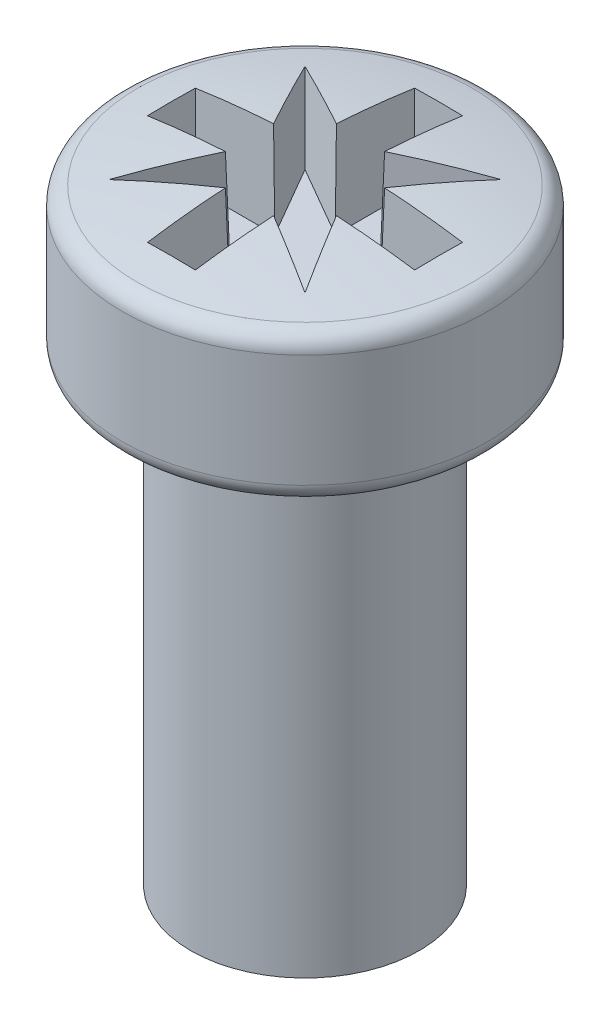
ISO-10303-21;
HEADER;
FILE_DESCRIPTION(('STEP AP214'),'2;1');
FILE_NAME('part.step','',(''),(''),'','','');
FILE_SCHEMA(('AUTOMOTIVE_DESIGN { 1 0 10303 214 1 1 1 1 }'));
ENDSEC;
DATA;
#1=APPLICATION_CONTEXT('core data for automotive mechanical design processes');
#2=APPLICATION_PROTOCOL_DEFINITION('international standard','automotive_design',2000,#1);
#3=PRODUCT_CONTEXT('',#1,'mechanical');
#4=PRODUCT('Part','Part','',(#3));
#5=PRODUCT_RELATED_PRODUCT_CATEGORY('part','',(#4));
#6=PRODUCT_DEFINITION_FORMATION('','',#4);
#7=PRODUCT_DEFINITION_CONTEXT('part definition',#1,'design');
#8=PRODUCT_DEFINITION('design','',#6,#7);
#9=PRODUCT_DEFINITION_SHAPE('','',#8);
#10=(LENGTH_UNIT() NAMED_UNIT(*) SI_UNIT(.MILLI.,.METRE.));
#11=(NAMED_UNIT(*) PLANE_ANGLE_UNIT() SI_UNIT($,.RADIAN.));
#12=(NAMED_UNIT(*) SI_UNIT($,.STERADIAN.) SOLID_ANGLE_UNIT());
#13=UNCERTAINTY_MEASURE_WITH_UNIT(LENGTH_MEASURE(1.E-05),#10,'distance_accuracy_value','');
#14=(GEOMETRIC_REPRESENTATION_CONTEXT(3) GLOBAL_UNCERTAINTY_ASSIGNED_CONTEXT((#13)) GLOBAL_UNIT_ASSIGNED_CONTEXT((#10,
#11,#12)) REPRESENTATION_CONTEXT('',''));
#15=CARTESIAN_POINT('',(0.,0.,0.));
#16=DIRECTION('',(0.,0.,1.));
#17=DIRECTION('',(1.,0.,0.));
#18=AXIS2_PLACEMENT_3D('',#15,#16,#17);
#19=CARTESIAN_POINT('',(1.45,0.75,0.25));
#20=DIRECTION('',(0.,1.,0.));
#21=DIRECTION('',(0.,0.,1.));
#22=AXIS2_PLACEMENT_3D('',#19,#20,#21);
#23=PLANE('',#22);
#24=DIRECTION('',(0.866025403784437,0.,0.500000000000003));
#25=VECTOR('',#24,1.);
#26=CARTESIAN_POINT('',(1.04261448545027,0.75,1.0366534699211));
#27=LINE('',#26,#25);
#28=CARTESIAN_POINT('',(0.245636233767946,0.75,0.576517861774035));
#29=VERTEX_POINT('',#28);
#30=CARTESIAN_POINT('',(1.02851057127591,0.75,1.02851057127591));
#31=VERTEX_POINT('',#30);
#32=EDGE_CURVE('E401',#29,#31,#27,.T.);
#33=ORIENTED_EDGE('',*,*,#32,.T.);
#34=DIRECTION('',(-0.500000000000003,0.,-0.866025403784437));
#35=VECTOR('',#34,1.);
#36=CARTESIAN_POINT('',(0.580296994187172,0.75,0.252181883116027));
#37=LINE('',#36,#35);
#38=CARTESIAN_POINT('',(0.576517861774036,0.75,0.245636233767945));
#39=VERTEX_POINT('',#38);
#40=EDGE_CURVE('E406',#31,#39,#37,.T.);
#41=ORIENTED_EDGE('',*,*,#40,.T.);
#42=DIRECTION('',(1.,0.,0.));
#43=VECTOR('',#42,1.);
#44=CARTESIAN_POINT('',(0.584076126600307,0.75,0.245636233767946));
#45=LINE('',#44,#43);
#46=CARTESIAN_POINT('',(1.44563623376795,0.75,0.245636233767946));
#47=VERTEX_POINT('',#46);
#48=EDGE_CURVE('E419',#39,#47,#45,.T.);
#49=ORIENTED_EDGE('',*,*,#48,.T.);
#50=DIRECTION('',(0.,0.,1.));
#51=VECTOR('',#50,1.);
#52=CARTESIAN_POINT('',(1.44563623376795,0.75,0.25));
#53=LINE('',#52,#51);
#54=CARTESIAN_POINT('',(1.44563623376795,0.75,-0.245636233767946));
#55=VERTEX_POINT('',#54);
#56=EDGE_CURVE('E415',#47,#55,#53,.F.);
#57=ORIENTED_EDGE('',*,*,#56,.T.);
#58=DIRECTION('',(1.,0.,0.));
#59=VECTOR('',#58,1.);
#60=CARTESIAN_POINT('',(0.584076126600307,0.75,-0.245636233767946));
#61=LINE('',#60,#59);
#62=CARTESIAN_POINT('',(0.576517861774036,0.75,-0.245636233767946));
#63=VERTEX_POINT('',#62);
#64=EDGE_CURVE('E409',#55,#63,#61,.F.);
#65=ORIENTED_EDGE('',*,*,#64,.T.);
#66=DIRECTION('',(0.500000000000002,0.,-0.866025403784438));
#67=VECTOR('',#66,1.);
#68=CARTESIAN_POINT('',(0.580296994187172,0.75,-0.252181883116027));
#69=LINE('',#68,#67);
#70=CARTESIAN_POINT('',(1.02851057127591,0.75,-1.02851057127591));
#71=VERTEX_POINT('',#70);
#72=EDGE_CURVE('E423',#63,#71,#69,.T.);
#73=ORIENTED_EDGE('',*,*,#72,.T.);
#74=DIRECTION('',(-0.866025403784437,0.,0.500000000000004));
#75=VECTOR('',#74,1.);
#76=CARTESIAN_POINT('',(1.04261448545027,0.75,-1.03665346992111));
#77=LINE('',#76,#75);
#78=CARTESIAN_POINT('',(0.245636233767946,0.75,-0.576517861774035));
#79=VERTEX_POINT('',#78);
#80=EDGE_CURVE('E428',#71,#79,#77,.T.);
#81=ORIENTED_EDGE('',*,*,#80,.T.);
#82=DIRECTION('',(0.,0.,1.));
#83=VECTOR('',#82,1.);
#84=CARTESIAN_POINT('',(0.245636233767946,0.75,-1.45));
#85=LINE('',#84,#83);
#86=CARTESIAN_POINT('',(0.245636233767946,0.75,-1.44563623376794));
#87=VERTEX_POINT('',#86);
#88=EDGE_CURVE('E272',#79,#87,#85,.F.);
#89=ORIENTED_EDGE('',*,*,#88,.T.);
#90=DIRECTION('',(1.,0.,0.));
#91=VECTOR('',#90,1.);
#92=CARTESIAN_POINT('',(-0.250000000000001,0.75,-1.44563623376795));
#93=LINE('',#92,#91);
#94=CARTESIAN_POINT('',(-0.245636233767947,0.75,-1.44563623376795));
#95=VERTEX_POINT('',#94);
#96=EDGE_CURVE('E273',#87,#95,#93,.F.);
#97=ORIENTED_EDGE('',*,*,#96,.T.);
#98=DIRECTION('',(0.,0.,1.));
#99=VECTOR('',#98,1.);
#100=CARTESIAN_POINT('',(-0.245636233767947,0.75,-1.45));
#101=LINE('',#100,#99);
#102=CARTESIAN_POINT('',(-0.245636233767946,0.75,-0.576517861774035));
#103=VERTEX_POINT('',#102);
#104=EDGE_CURVE('E278',#95,#103,#101,.T.);
#105=ORIENTED_EDGE('',*,*,#104,.T.);
#106=DIRECTION('',(-0.866025403784437,0.,-0.500000000000004));
#107=VECTOR('',#106,1.);
#108=CARTESIAN_POINT('',(-1.04261448545027,0.75,-1.03665346992111));
#109=LINE('',#108,#107);
#110=CARTESIAN_POINT('',(-1.02851057127591,0.75,-1.02851057127591));
#111=VERTEX_POINT('',#110);
#112=EDGE_CURVE('E283',#103,#111,#109,.T.);
#113=ORIENTED_EDGE('',*,*,#112,.T.);
#114=DIRECTION('',(0.500000000000002,0.,0.866025403784438));
#115=VECTOR('',#114,1.);
#116=CARTESIAN_POINT('',(-0.580296994187172,0.75,-0.252181883116027));
#117=LINE('',#116,#115);
#118=CARTESIAN_POINT('',(-0.576517861774036,0.75,-0.245636233767945));
#119=VERTEX_POINT('',#118);
#120=EDGE_CURVE('E288',#111,#119,#117,.T.);
#121=ORIENTED_EDGE('',*,*,#120,.T.);
#122=DIRECTION('',(1.,0.,0.));
#123=VECTOR('',#122,1.);
#124=CARTESIAN_POINT('',(-0.584076126600307,0.75,-0.245636233767946));
#125=LINE('',#124,#123);
#126=CARTESIAN_POINT('',(-1.44563623376795,0.75,-0.245636233767946));
#127=VERTEX_POINT('',#126);
#128=EDGE_CURVE('E293',#119,#127,#125,.F.);
#129=ORIENTED_EDGE('',*,*,#128,.T.);
#130=DIRECTION('',(0.,0.,1.));
#131=VECTOR('',#130,1.);
#132=CARTESIAN_POINT('',(-1.44563623376795,0.75,0.250000000000001));
#133=LINE('',#132,#131);
#134=CARTESIAN_POINT('',(-1.44563623376795,0.75,0.245636233767947));
#135=VERTEX_POINT('',#134);
#136=EDGE_CURVE('E452',#127,#135,#133,.T.);
#137=ORIENTED_EDGE('',*,*,#136,.T.);
#138=DIRECTION('',(1.,0.,0.));
#139=VECTOR('',#138,1.);
#140=CARTESIAN_POINT('',(-0.584076126600307,0.75,0.245636233767946));
#141=LINE('',#140,#139);
#142=CARTESIAN_POINT('',(-0.576517861774036,0.75,0.245636233767946));
#143=VERTEX_POINT('',#142);
#144=EDGE_CURVE('E457',#135,#143,#141,.T.);
#145=ORIENTED_EDGE('',*,*,#144,.T.);
#146=DIRECTION('',(-0.500000000000003,0.,0.866025403784437));
#147=VECTOR('',#146,1.);
#148=CARTESIAN_POINT('',(-0.580296994187172,0.75,0.252181883116027));
#149=LINE('',#148,#147);
#150=CARTESIAN_POINT('',(-1.02851057127591,0.75,1.02851057127591));
#151=VERTEX_POINT('',#150);
#152=EDGE_CURVE('E462',#143,#151,#149,.T.);
#153=ORIENTED_EDGE('',*,*,#152,.T.);
#154=DIRECTION('',(0.866025403784437,0.,-0.500000000000003));
#155=VECTOR('',#154,1.);
#156=CARTESIAN_POINT('',(-1.04261448545027,0.75,1.0366534699211));
#157=LINE('',#156,#155);
#158=CARTESIAN_POINT('',(-0.245636233767946,0.75,0.576517861774035));
#159=VERTEX_POINT('',#158);
#160=EDGE_CURVE('E467',#151,#159,#157,.T.);
#161=ORIENTED_EDGE('',*,*,#160,.T.);
#162=DIRECTION('',(0.,0.,1.));
#163=VECTOR('',#162,1.);
#164=CARTESIAN_POINT('',(-0.245636233767945,0.75,1.45));
#165=LINE('',#164,#163);
#166=CARTESIAN_POINT('',(-0.245636233767945,0.75,1.44563623376795));
#167=VERTEX_POINT('',#166);
#168=EDGE_CURVE('E390',#159,#167,#165,.T.);
#169=ORIENTED_EDGE('',*,*,#168,.T.);
#170=DIRECTION('',(1.,0.,0.));
#171=VECTOR('',#170,1.);
#172=CARTESIAN_POINT('',(-0.25,0.75,1.44563623376795));
#173=LINE('',#172,#171);
#174=CARTESIAN_POINT('',(0.245636233767947,0.75,1.44563623376795));
#175=VERTEX_POINT('',#174);
#176=EDGE_CURVE('E391',#167,#175,#173,.T.);
#177=ORIENTED_EDGE('',*,*,#176,.T.);
#178=DIRECTION('',(0.,0.,1.));
#179=VECTOR('',#178,1.);
#180=CARTESIAN_POINT('',(0.245636233767947,0.75,1.45));
#181=LINE('',#180,#179);
#182=EDGE_CURVE('E396',#175,#29,#181,.F.);
#183=ORIENTED_EDGE('',*,*,#182,.T.);
#184=EDGE_LOOP('',(#33,#41,#49,#57,#65,#73,#81,#89,#97,#105,#113,#121,#129,#137,#145,#153,#161,
#169,#177,#183));
#185=FACE_BOUND('',#184,.T.);
#186=ADVANCED_FACE('F16',(#185),#23,.T.);
#187=CARTESIAN_POINT('',(0.584076126600307,1.,0.25));
#188=DIRECTION('',(0.,-0.0174524064372835,0.999847695156391));
#189=DIRECTION('',(0.,-0.999847695156391,-0.0174524064372835));
#190=AXIS2_PLACEMENT_3D('',#187,#188,#189);
#191=PLANE('',#190);
#192=ORIENTED_EDGE('',*,*,#48,.F.);
#193=DIRECTION('',(0.0302146533529296,0.999391197828466,0.0174444382467851));
#194=VECTOR('',#193,1.);
#195=CARTESIAN_POINT('',(0.576517861774036,0.75,0.245636233767945));
#196=LINE('',#195,#194);
#197=CARTESIAN_POINT('',(0.607598757212809,1.77804334093299,0.263580797282622));
#198=VERTEX_POINT('',#197);
#199=EDGE_CURVE('E404',#39,#198,#196,.T.);
#200=ORIENTED_EDGE('',*,*,#199,.T.);
#201=CARTESIAN_POINT('',(1.46202785908939,1.68907558573134,0.262027859089389));
#202=CARTESIAN_POINT('',(1.32026032340579,1.71002232539284,0.262393485790215));
#203=CARTESIAN_POINT('',(1.17817413049149,1.72790967481918,0.262705710635846));
#204=CARTESIAN_POINT('',(0.893364430201512,1.7575655932015,0.263223356616717));
#205=CARTESIAN_POINT('',(0.750640922825825,1.7693341621575,0.263428777751957));
#206=CARTESIAN_POINT('',(0.607598758219443,1.77804334087832,0.263580797032002));
#207=B_SPLINE_CURVE_WITH_KNOTS('',3,(#201,#202,#203,#204,#205,#206),.UNSPECIFIED.,.F.,.F.,(4,2,
4),(0.,0.429624101670975,0.85924820334195),.UNSPECIFIED.);
#208=CARTESIAN_POINT('',(1.46202785908939,1.68907558573134,0.26202785908939));
#209=VERTEX_POINT('',#208);
#210=EDGE_CURVE('E177',#209,#198,#207,.T.);
#211=ORIENTED_EDGE('',*,*,#210,.F.);
#212=DIRECTION('',(-0.0174497491606828,-0.999695459881887,-0.0174497491606828));
#213=VECTOR('',#212,1.);
#214=CARTESIAN_POINT('',(1.46202785908939,1.68907558573133,0.26202785908939));
#215=LINE('',#214,#213);
#216=EDGE_CURVE('E173',#209,#47,#215,.T.);
#217=ORIENTED_EDGE('',*,*,#216,.T.);
#218=EDGE_LOOP('',(#192,#200,#211,#217));
#219=FACE_BOUND('',#218,.T.);
#220=ADVANCED_FACE('F677',(#219),#191,.F.);
#221=CARTESIAN_POINT('',(0.584076126600307,1.,0.25));
#222=DIRECTION('',(0.865893503920752,-0.0174524064372836,-0.499923847578198));
#223=DIRECTION('',(-0.500000000000003,0.,-0.866025403784437));
#224=AXIS2_PLACEMENT_3D('',#221,#222,#223);
#225=PLANE('',#224);
#226=ORIENTED_EDGE('',*,*,#40,.F.);
#227=DIRECTION('',(0.0475800424954295,0.997733571206395,0.0475800424954295));
#228=VECTOR('',#227,1.);
#229=CARTESIAN_POINT('',(1.02851057127591,0.75,1.02851057127591));
#230=LINE('',#229,#228);
#231=CARTESIAN_POINT('',(1.07306003218654,1.68418354416022,1.07306003218654));
#232=VERTEX_POINT('',#231);
#233=EDGE_CURVE('E399',#31,#232,#230,.T.);
#234=ORIENTED_EDGE('',*,*,#233,.T.);
#235=CARTESIAN_POINT('',(0.607598757356492,1.77804334091766,0.263580797532024));
#236=CARTESIAN_POINT('',(0.685653461591582,1.76970725355828,0.399066524929171));
#237=CARTESIAN_POINT('',(0.763469253278298,1.75771756014881,0.53426599151562));
#238=CARTESIAN_POINT('',(0.918623011554979,1.72643096122967,0.804092403067125));
#239=CARTESIAN_POINT('',(0.995960978144946,1.70713405571999,0.93871934803218));
#240=CARTESIAN_POINT('',(1.07306003218654,1.68418354416022,1.07306003218654));
#241=B_SPLINE_CURVE_WITH_KNOTS('',3,(#235,#236,#237,#238,#239,#240),.UNSPECIFIED.,.F.,.F.,(4,2,
4),(0.,0.469362880447843,0.938725760895685),.UNSPECIFIED.);
#242=EDGE_CURVE('E773',#198,#232,#241,.T.);
#243=ORIENTED_EDGE('',*,*,#242,.F.);
#244=ORIENTED_EDGE('',*,*,#199,.F.);
#245=EDGE_LOOP('',(#226,#234,#243,#244));
#246=FACE_BOUND('',#245,.T.);
#247=ADVANCED_FACE('F670',(#246),#225,.F.);
#248=CARTESIAN_POINT('',(1.04043260233424,1.,1.04043260233424));
#249=DIRECTION('',(-0.499923847578198,-0.0174524064372836,0.865893503920752));
#250=DIRECTION('',(0.866025403784437,0.,0.500000000000003));
#251=AXIS2_PLACEMENT_3D('',#248,#249,#250);
#252=PLANE('',#251);
#253=ORIENTED_EDGE('',*,*,#32,.F.);
#254=DIRECTION('',(0.017444438246785,0.999391197828466,0.0302146533529296));
#255=VECTOR('',#254,1.);
#256=CARTESIAN_POINT('',(0.245636233767946,0.75,0.576517861774035));
#257=LINE('',#256,#255);
#258=CARTESIAN_POINT('',(0.26358079703322,1.77804334094833,0.607598757069126));
#259=VERTEX_POINT('',#258);
#260=EDGE_CURVE('E394',#29,#259,#257,.T.);
#261=ORIENTED_EDGE('',*,*,#260,.T.);
#262=CARTESIAN_POINT('',(1.07306003218653,1.68418354416022,1.07306003218654));
#263=CARTESIAN_POINT('',(0.938719347949565,1.7071340557341,0.995960978097533));
#264=CARTESIAN_POINT('',(0.804092402901637,1.72643096125338,0.918623011459912));
#265=CARTESIAN_POINT('',(0.534265991183865,1.75771756018275,0.763469253087442));
#266=CARTESIAN_POINT('',(0.399066524514021,1.76970725359284,0.685653461352592));
#267=CARTESIAN_POINT('',(0.263580797033219,1.77804334094834,0.607598757069127));
#268=B_SPLINE_CURVE_WITH_KNOTS('',3,(#262,#263,#264,#265,#266,#267),.UNSPECIFIED.,.F.,.F.,(4,2,
4),(0.,0.469362880736001,0.938725761472001),.UNSPECIFIED.);
#269=EDGE_CURVE('E769',#232,#259,#268,.T.);
#270=ORIENTED_EDGE('',*,*,#269,.F.);
#271=ORIENTED_EDGE('',*,*,#233,.F.);
#272=EDGE_LOOP('',(#253,#261,#270,#271));
#273=FACE_BOUND('',#272,.T.);
#274=ADVANCED_FACE('F663',(#273),#252,.F.);
#275=CARTESIAN_POINT('',(0.250000000000001,1.,1.45));
#276=DIRECTION('',(0.999847695156391,-0.0174524064372835,0.));
#277=DIRECTION('',(0.0174524064372835,0.999847695156391,0.));
#278=AXIS2_PLACEMENT_3D('',#275,#276,#277);
#279=PLANE('',#278);
#280=ORIENTED_EDGE('',*,*,#182,.F.);
#281=DIRECTION('',(0.0174497491606828,0.999695459881887,0.0174497491606828));
#282=VECTOR('',#281,1.);
#283=CARTESIAN_POINT('',(0.245636233767947,0.75,1.44563623376795));
#284=LINE('',#283,#282);
#285=CARTESIAN_POINT('',(0.262027859089391,1.68907558573133,1.46202785908939));
#286=VERTEX_POINT('',#285);
#287=EDGE_CURVE('E383',#175,#286,#284,.T.);
#288=ORIENTED_EDGE('',*,*,#287,.T.);
#289=CARTESIAN_POINT('',(0.263580797033219,1.77804334094834,0.607598757069126));
#290=CARTESIAN_POINT('',(0.26342877775326,1.76933416223229,0.750640921868584));
#291=CARTESIAN_POINT('',(0.263223356617962,1.75756559327285,0.893364429436668));
#292=CARTESIAN_POINT('',(0.262705710636685,1.72790967486718,1.17817413011009));
#293=CARTESIAN_POINT('',(0.262393485790708,1.71002232542096,1.32026032321543));
#294=CARTESIAN_POINT('',(0.262027859089391,1.68907558573134,1.46202785908939));
#295=B_SPLINE_CURVE_WITH_KNOTS('',3,(#289,#290,#291,#292,#293,#294),.UNSPECIFIED.,.F.,.F.,(4,2,
4),(0.,0.429624102247064,0.859248204494128),.UNSPECIFIED.);
#296=EDGE_CURVE('E380',#259,#286,#295,.T.);
#297=ORIENTED_EDGE('',*,*,#296,.F.);
#298=ORIENTED_EDGE('',*,*,#260,.F.);
#299=EDGE_LOOP('',(#280,#288,#297,#298));
#300=FACE_BOUND('',#299,.T.);
#301=ADVANCED_FACE('F370',(#300),#279,.F.);
#302=CARTESIAN_POINT('',(-0.25,1.,1.45));
#303=DIRECTION('',(0.,-0.0174524064372835,0.999847695156391));
#304=DIRECTION('',(0.,-0.999847695156391,-0.0174524064372835));
#305=AXIS2_PLACEMENT_3D('',#302,#303,#304);
#306=PLANE('',#305);
#307=ORIENTED_EDGE('',*,*,#176,.F.);
#308=DIRECTION('',(-0.0174497491606827,0.999695459881887,0.0174497491606828));
#309=VECTOR('',#308,1.);
#310=CARTESIAN_POINT('',(-0.245636233767945,0.75,1.44563623376795));
#311=LINE('',#310,#309);
#312=CARTESIAN_POINT('',(-0.26202785908939,1.68907558573134,1.46202785908939));
#313=VERTEX_POINT('',#312);
#314=EDGE_CURVE('E469',#167,#313,#311,.T.);
#315=ORIENTED_EDGE('',*,*,#314,.T.);
#316=CARTESIAN_POINT('',(0.262027859089391,1.68907558573133,1.46202785908939));
#317=CARTESIAN_POINT('',(0.,1.69600058834905,1.46214873545971));
#318=CARTESIAN_POINT('',(-0.26202785908939,1.68907558573133,1.46202785908939));
#319=B_SPLINE_CURVE_WITH_KNOTS('',2,(#316,#317,#318),.UNSPECIFIED.,.F.,.F.,(3,3),(0.,1.),.UNSPECIFIED.);
#320=EDGE_CURVE('E375',#286,#313,#319,.T.);
#321=ORIENTED_EDGE('',*,*,#320,.F.);
#322=ORIENTED_EDGE('',*,*,#287,.F.);
#323=EDGE_LOOP('',(#307,#315,#321,#322));
#324=FACE_BOUND('',#323,.T.);
#325=ADVANCED_FACE('F365',(#324),#306,.F.);
#326=CARTESIAN_POINT('',(-0.25,1.,1.45));
#327=DIRECTION('',(-0.999847695156391,-0.0174524064372835,0.));
#328=DIRECTION('',(0.0174524064372835,-0.999847695156391,0.));
#329=AXIS2_PLACEMENT_3D('',#326,#327,#328);
#330=PLANE('',#329);
#331=ORIENTED_EDGE('',*,*,#168,.F.);
#332=DIRECTION('',(-0.017444438246785,0.999391197828466,0.0302146533529295));
#333=VECTOR('',#332,1.);
#334=CARTESIAN_POINT('',(-0.245636233767946,0.75,0.576517861774035));
#335=LINE('',#334,#333);
#336=CARTESIAN_POINT('',(-0.263580797033221,1.77804334094833,0.607598757069126));
#337=VERTEX_POINT('',#336);
#338=EDGE_CURVE('E464',#159,#337,#335,.T.);
#339=ORIENTED_EDGE('',*,*,#338,.T.);
#340=CARTESIAN_POINT('',(-0.26202785908939,1.68907558573134,1.46202785908939));
#341=CARTESIAN_POINT('',(-0.262393485790707,1.71002232542096,1.32026032321543));
#342=CARTESIAN_POINT('',(-0.262705710636684,1.72790967486718,1.17817413011009));
#343=CARTESIAN_POINT('',(-0.263223356617961,1.75756559327285,0.893364429436668));
#344=CARTESIAN_POINT('',(-0.263428777753261,1.76933416223229,0.750640921868584));
#345=CARTESIAN_POINT('',(-0.263580797033221,1.77804334094834,0.607598757069126));
#346=B_SPLINE_CURVE_WITH_KNOTS('',3,(#340,#341,#342,#343,#344,#345),.UNSPECIFIED.,.F.,.F.,(4,2,
4),(0.,0.429624102247064,0.859248204494128),.UNSPECIFIED.);
#347=EDGE_CURVE('E351',#313,#337,#346,.T.);
#348=ORIENTED_EDGE('',*,*,#347,.F.);
#349=ORIENTED_EDGE('',*,*,#314,.F.);
#350=EDGE_LOOP('',(#331,#339,#348,#349));
#351=FACE_BOUND('',#350,.T.);
#352=ADVANCED_FACE('F360',(#351),#330,.F.);
#353=CARTESIAN_POINT('',(-1.04043260233424,1.,1.04043260233424));
#354=DIRECTION('',(0.499923847578198,-0.0174524064372836,0.865893503920752));
#355=DIRECTION('',(0.866025403784437,0.,-0.500000000000003));
#356=AXIS2_PLACEMENT_3D('',#353,#354,#355);
#357=PLANE('',#356);
#358=ORIENTED_EDGE('',*,*,#160,.F.);
#359=DIRECTION('',(-0.0475800424954293,0.997733571206395,0.0475800424954295));
#360=VECTOR('',#359,1.);
#361=CARTESIAN_POINT('',(-1.02851057127591,0.75,1.02851057127591));
#362=LINE('',#361,#360);
#363=CARTESIAN_POINT('',(-1.07306003218654,1.68418354416022,1.07306003218654));
#364=VERTEX_POINT('',#363);
#365=EDGE_CURVE('E459',#151,#364,#362,.T.);
#366=ORIENTED_EDGE('',*,*,#365,.T.);
#367=CARTESIAN_POINT('',(-0.263580797033221,1.77804334094834,0.607598757069126));
#368=CARTESIAN_POINT('',(-0.399066524514022,1.76970725359284,0.685653461352592));
#369=CARTESIAN_POINT('',(-0.534265991183866,1.75771756018275,0.763469253087442));
#370=CARTESIAN_POINT('',(-0.804092402901637,1.72643096125338,0.918623011459913));
#371=CARTESIAN_POINT('',(-0.938719347949565,1.7071340557341,0.995960978097534));
#372=CARTESIAN_POINT('',(-1.07306003218654,1.68418354416022,1.07306003218654));
#373=B_SPLINE_CURVE_WITH_KNOTS('',3,(#367,#368,#369,#370,#371,#372),.UNSPECIFIED.,.F.,.F.,(4,2,
4),(0.,0.469362880736001,0.938725761472001),.UNSPECIFIED.);
#374=EDGE_CURVE('E345',#337,#364,#373,.T.);
#375=ORIENTED_EDGE('',*,*,#374,.F.);
#376=ORIENTED_EDGE('',*,*,#338,.F.);
#377=EDGE_LOOP('',(#358,#366,#375,#376));
#378=FACE_BOUND('',#377,.T.);
#379=ADVANCED_FACE('F357',(#378),#357,.F.);
#380=CARTESIAN_POINT('',(-0.584076126600307,1.,0.25));
#381=DIRECTION('',(-0.865893503920752,-0.0174524064372836,-0.499923847578198));
#382=DIRECTION('',(-0.500000000000003,0.,0.866025403784437));
#383=AXIS2_PLACEMENT_3D('',#380,#381,#382);
#384=PLANE('',#383);
#385=ORIENTED_EDGE('',*,*,#152,.F.);
#386=DIRECTION('',(-0.0302146533529296,0.999391197828466,0.0174444382467851));
#387=VECTOR('',#386,1.);
#388=CARTESIAN_POINT('',(-0.576517861774036,0.75,0.245636233767946));
#389=LINE('',#388,#387);
#390=CARTESIAN_POINT('',(-0.607598757354815,1.77804334093095,0.263580797032916));
#391=VERTEX_POINT('',#390);
#392=EDGE_CURVE('E454',#143,#391,#389,.T.);
#393=ORIENTED_EDGE('',*,*,#392,.T.);
#394=CARTESIAN_POINT('',(-1.07306003218654,1.68418354416022,1.07306003218654));
#395=CARTESIAN_POINT('',(-0.995960978192184,1.70713405570594,0.938719348114491));
#396=CARTESIAN_POINT('',(-0.918623011649697,1.72643096120604,0.804092403232006));
#397=CARTESIAN_POINT('',(-0.763469253468453,1.757717560115,0.53426599184616));
#398=CARTESIAN_POINT('',(-0.685653461829697,1.76970725352386,0.399066525342798));
#399=CARTESIAN_POINT('',(-0.607598757642805,1.7780433408871,0.263580798028999));
#400=B_SPLINE_CURVE_WITH_KNOTS('',3,(#394,#395,#396,#397,#398,#399),.UNSPECIFIED.,.F.,.F.,(4,2,
4),(0.,0.46936288016074,0.93872576032148),.UNSPECIFIED.);
#401=EDGE_CURVE('E334',#364,#391,#400,.T.);
#402=ORIENTED_EDGE('',*,*,#401,.F.);
#403=ORIENTED_EDGE('',*,*,#365,.F.);
#404=EDGE_LOOP('',(#385,#393,#402,#403));
#405=FACE_BOUND('',#404,.T.);
#406=ADVANCED_FACE('F323',(#405),#384,.F.);
#407=CARTESIAN_POINT('',(-0.584076126600307,1.,0.25));
#408=DIRECTION('',(0.,-0.0174524064372835,0.999847695156391));
#409=DIRECTION('',(0.,-0.999847695156391,-0.0174524064372835));
#410=AXIS2_PLACEMENT_3D('',#407,#408,#409);
#411=PLANE('',#410);
#412=ORIENTED_EDGE('',*,*,#144,.F.);
#413=DIRECTION('',(-0.0174497491606828,0.999695459881887,0.0174497491606828));
#414=VECTOR('',#413,1.);
#415=CARTESIAN_POINT('',(-1.44563623376795,0.75,0.245636233767947));
#416=LINE('',#415,#414);
#417=CARTESIAN_POINT('',(-1.46202785908939,1.68907558573133,0.262027859089391));
#418=VERTEX_POINT('',#417);
#419=EDGE_CURVE('E449',#135,#418,#416,.T.);
#420=ORIENTED_EDGE('',*,*,#419,.T.);
#421=CARTESIAN_POINT('',(-0.607598757640504,1.77804334091356,0.263580797032611));
#422=CARTESIAN_POINT('',(-0.750640922344059,1.76933416219514,0.263428777752611));
#423=CARTESIAN_POINT('',(-0.893364429816577,1.75756559323741,0.263223356617343));
#424=CARTESIAN_POINT('',(-1.17817413029954,1.72790967484334,0.262705710636269));
#425=CARTESIAN_POINT('',(-1.32026032330998,1.71002232540699,0.262393485790463));
#426=CARTESIAN_POINT('',(-1.46202785908939,1.68907558573134,0.262027859089388));
#427=B_SPLINE_CURVE_WITH_KNOTS('',3,(#421,#422,#423,#424,#425,#426),.UNSPECIFIED.,.F.,.F.,(4,2,
4),(0.,0.429624101960914,0.859248203921828),.UNSPECIFIED.);
#428=EDGE_CURVE('E301',#391,#418,#427,.T.);
#429=ORIENTED_EDGE('',*,*,#428,.F.);
#430=ORIENTED_EDGE('',*,*,#392,.F.);
#431=EDGE_LOOP('',(#412,#420,#429,#430));
#432=FACE_BOUND('',#431,.T.);
#433=ADVANCED_FACE('F315',(#432),#411,.F.);
#434=CARTESIAN_POINT('',(-1.45,1.,0.250000000000001));
#435=DIRECTION('',(-0.999847695156391,-0.0174524064372835,0.));
#436=DIRECTION('',(0.0174524064372835,-0.999847695156391,0.));
#437=AXIS2_PLACEMENT_3D('',#434,#435,#436);
#438=PLANE('',#437);
#439=ORIENTED_EDGE('',*,*,#136,.F.);
#440=DIRECTION('',(-0.0174497491606828,0.999695459881887,-0.0174497491606827));
#441=VECTOR('',#440,1.);
#442=CARTESIAN_POINT('',(-1.44563623376795,0.75,-0.245636233767946));
#443=LINE('',#442,#441);
#444=CARTESIAN_POINT('',(-1.46202785908939,1.68907558573134,-0.262027859089391));
#445=VERTEX_POINT('',#444);
#446=EDGE_CURVE('E291',#127,#445,#443,.T.);
#447=ORIENTED_EDGE('',*,*,#446,.T.);
#448=CARTESIAN_POINT('',(-1.46208828672152,1.69253748245776,0.));
#449=CARTESIAN_POINT('',(-1.46208828672152,1.69253748245776,-0.131036805700679));
#450=CARTESIAN_POINT('',(-1.46202785908939,1.68907558573133,-0.262027859089391));
#451=B_SPLINE_CURVE_WITH_KNOTS('',2,(#448,#449,#450),.UNSPECIFIED.,.F.,.F.,(3,3),(0.,1.),.UNSPECIFIED.);
#452=CARTESIAN_POINT('',(-1.46208828672152,1.69253748245776,0.));
#453=VERTEX_POINT('',#452);
#454=EDGE_CURVE('E300',#453,#445,#451,.T.);
#455=ORIENTED_EDGE('',*,*,#454,.F.);
#456=CARTESIAN_POINT('',(-1.46202785908939,1.68907558573133,0.262027859089391));
#457=CARTESIAN_POINT('',(-1.46208828672152,1.69253748245776,0.131036805700681));
#458=CARTESIAN_POINT('',(-1.46208828672152,1.69253748245776,0.));
#459=B_SPLINE_CURVE_WITH_KNOTS('',2,(#456,#457,#458),.UNSPECIFIED.,.F.,.F.,(3,3),(0.,1.),.UNSPECIFIED.);
#460=EDGE_CURVE('E296',#418,#453,#459,.T.);
#461=ORIENTED_EDGE('',*,*,#460,.F.);
#462=ORIENTED_EDGE('',*,*,#419,.F.);
#463=EDGE_LOOP('',(#439,#447,#455,#461,#462));
#464=FACE_BOUND('',#463,.T.);
#465=ADVANCED_FACE('F304',(#464),#438,.F.);
#466=CARTESIAN_POINT('',(-0.584076126600307,1.,-0.25));
#467=DIRECTION('',(0.,-0.0174524064372835,-0.999847695156391));
#468=DIRECTION('',(0.,0.999847695156391,-0.0174524064372835));
#469=AXIS2_PLACEMENT_3D('',#466,#467,#468);
#470=PLANE('',#469);
#471=ORIENTED_EDGE('',*,*,#128,.F.);
#472=DIRECTION('',(-0.0302146533529296,0.999391197828466,-0.0174444382467851));
#473=VECTOR('',#472,1.);
#474=CARTESIAN_POINT('',(-0.576517861774036,0.75,-0.245636233767945));
#475=LINE('',#474,#473);
#476=CARTESIAN_POINT('',(-0.607598757212808,1.77804334093299,-0.263580797282623));
#477=VERTEX_POINT('',#476);
#478=EDGE_CURVE('E286',#119,#477,#475,.T.);
#479=ORIENTED_EDGE('',*,*,#478,.T.);
#480=CARTESIAN_POINT('',(-1.46202785908939,1.68907558573134,-0.262027859089392));
#481=CARTESIAN_POINT('',(-1.32026032340579,1.71002232539284,-0.262393485790217));
#482=CARTESIAN_POINT('',(-1.1781741304915,1.72790967481918,-0.262705710635847));
#483=CARTESIAN_POINT('',(-0.893364430201513,1.7575655932015,-0.263223356616716));
#484=CARTESIAN_POINT('',(-0.750640922825827,1.7693341621575,-0.263428777751954));
#485=CARTESIAN_POINT('',(-0.607598758219444,1.77804334087832,-0.263580797031997));
#486=B_SPLINE_CURVE_WITH_KNOTS('',3,(#480,#481,#482,#483,#484,#485),.UNSPECIFIED.,.F.,.F.,(4,2,
4),(0.,0.429624101670975,0.85924820334195),.UNSPECIFIED.);
#487=EDGE_CURVE('E335',#445,#477,#486,.T.);
#488=ORIENTED_EDGE('',*,*,#487,.F.);
#489=ORIENTED_EDGE('',*,*,#446,.F.);
#490=EDGE_LOOP('',(#471,#479,#488,#489));
#491=FACE_BOUND('',#490,.T.);
#492=ADVANCED_FACE('F314',(#491),#470,.F.);
#493=CARTESIAN_POINT('',(-0.584076126600307,1.,-0.25));
#494=DIRECTION('',(-0.865893503920753,-0.0174524064372836,0.499923847578197));
#495=DIRECTION('',(0.500000000000002,0.,0.866025403784438));
#496=AXIS2_PLACEMENT_3D('',#493,#494,#495);
#497=PLANE('',#496);
#498=ORIENTED_EDGE('',*,*,#120,.F.);
#499=DIRECTION('',(-0.047580042495429,0.997733571206395,-0.0475800424954293));
#500=VECTOR('',#499,1.);
#501=CARTESIAN_POINT('',(-1.02851057127591,0.75,-1.02851057127591));
#502=LINE('',#501,#500);
#503=CARTESIAN_POINT('',(-1.07306003218653,1.68418354416022,-1.07306003218654));
#504=VERTEX_POINT('',#503);
#505=EDGE_CURVE('E281',#111,#504,#502,.T.);
#506=ORIENTED_EDGE('',*,*,#505,.T.);
#507=CARTESIAN_POINT('',(-0.60759875735649,1.77804334091766,-0.263580797532026));
#508=CARTESIAN_POINT('',(-0.685653461591581,1.76970725355828,-0.399066524929172));
#509=CARTESIAN_POINT('',(-0.763469253278297,1.75771756014881,-0.53426599151562));
#510=CARTESIAN_POINT('',(-0.918623011554978,1.72643096122967,-0.804092403067123));
#511=CARTESIAN_POINT('',(-0.995960978144943,1.70713405571999,-0.938719348032178));
#512=CARTESIAN_POINT('',(-1.07306003218653,1.68418354416022,-1.07306003218654));
#513=B_SPLINE_CURVE_WITH_KNOTS('',3,(#507,#508,#509,#510,#511,#512),.UNSPECIFIED.,.F.,.F.,(4,2,
4),(0.,0.46936288044784,0.93872576089568),.UNSPECIFIED.);
#514=EDGE_CURVE('E818',#477,#504,#513,.T.);
#515=ORIENTED_EDGE('',*,*,#514,.F.);
#516=ORIENTED_EDGE('',*,*,#478,.F.);
#517=EDGE_LOOP('',(#498,#506,#515,#516));
#518=FACE_BOUND('',#517,.T.);
#519=ADVANCED_FACE('F618',(#518),#497,.F.);
#520=CARTESIAN_POINT('',(-1.04043260233424,1.,-1.04043260233424));
#521=DIRECTION('',(0.499923847578199,-0.0174524064372835,-0.865893503920752));
#522=DIRECTION('',(-0.866025403784437,0.,-0.500000000000004));
#523=AXIS2_PLACEMENT_3D('',#520,#521,#522);
#524=PLANE('',#523);
#525=ORIENTED_EDGE('',*,*,#112,.F.);
#526=DIRECTION('',(-0.017444438246785,0.999391197828466,-0.0302146533529296));
#527=VECTOR('',#526,1.);
#528=CARTESIAN_POINT('',(-0.245636233767946,0.75,-0.576517861774035));
#529=LINE('',#528,#527);
#530=CARTESIAN_POINT('',(-0.263580797033221,1.77804334094833,-0.607598757069125));
#531=VERTEX_POINT('',#530);
#532=EDGE_CURVE('E276',#103,#531,#529,.T.);
#533=ORIENTED_EDGE('',*,*,#532,.T.);
#534=CARTESIAN_POINT('',(-1.07306003218653,1.68418354416022,-1.07306003218654));
#535=CARTESIAN_POINT('',(-0.938719347949563,1.7071340557341,-0.995960978097532));
#536=CARTESIAN_POINT('',(-0.804092402901635,1.72643096125338,-0.918623011459912));
#537=CARTESIAN_POINT('',(-0.534265991183864,1.75771756018275,-0.763469253087441));
#538=CARTESIAN_POINT('',(-0.399066524514021,1.76970725359284,-0.68565346135259));
#539=CARTESIAN_POINT('',(-0.263580797033222,1.77804334094834,-0.607598757069122));
#540=B_SPLINE_CURVE_WITH_KNOTS('',3,(#534,#535,#536,#537,#538,#539),.UNSPECIFIED.,.F.,.F.,(4,2,
4),(0.,0.469362880736,0.938725761471999),.UNSPECIFIED.);
#541=EDGE_CURVE('E820',#504,#531,#540,.T.);
#542=ORIENTED_EDGE('',*,*,#541,.F.);
#543=ORIENTED_EDGE('',*,*,#505,.F.);
#544=EDGE_LOOP('',(#525,#533,#542,#543));
#545=FACE_BOUND('',#544,.T.);
#546=ADVANCED_FACE('F611',(#545),#524,.F.);
#547=CARTESIAN_POINT('',(-0.250000000000001,1.,-1.45));
#548=DIRECTION('',(-0.999847695156391,-0.0174524064372835,0.));
#549=DIRECTION('',(0.0174524064372835,-0.999847695156391,0.));
#550=AXIS2_PLACEMENT_3D('',#547,#548,#549);
#551=PLANE('',#550);
#552=ORIENTED_EDGE('',*,*,#104,.F.);
#553=DIRECTION('',(-0.0174497491606829,0.999695459881887,-0.0174497491606828));
#554=VECTOR('',#553,1.);
#555=CARTESIAN_POINT('',(-0.245636233767947,0.75,-1.44563623376795));
#556=LINE('',#555,#554);
#557=CARTESIAN_POINT('',(-0.262027859089391,1.68907558573133,-1.46202785908939));
#558=VERTEX_POINT('',#557);
#559=EDGE_CURVE('E265',#95,#558,#556,.T.);
#560=ORIENTED_EDGE('',*,*,#559,.T.);
#561=CARTESIAN_POINT('',(-0.263580797033221,1.77804334094834,-0.607598757069124));
#562=CARTESIAN_POINT('',(-0.263428777753261,1.76933416223229,-0.750640921868582));
#563=CARTESIAN_POINT('',(-0.263223356617962,1.75756559327285,-0.893364429436667));
#564=CARTESIAN_POINT('',(-0.262705710636686,1.72790967486718,-1.17817413011009));
#565=CARTESIAN_POINT('',(-0.262393485790709,1.71002232542096,-1.32026032321543));
#566=CARTESIAN_POINT('',(-0.262027859089393,1.68907558573134,-1.46202785908939));
#567=B_SPLINE_CURVE_WITH_KNOTS('',3,(#561,#562,#563,#564,#565,#566),.UNSPECIFIED.,.F.,.F.,(4,2,
4),(0.,0.429624102247066,0.859248204494133),.UNSPECIFIED.);
#568=EDGE_CURVE('E262',#531,#558,#567,.T.);
#569=ORIENTED_EDGE('',*,*,#568,.F.);
#570=ORIENTED_EDGE('',*,*,#532,.F.);
#571=EDGE_LOOP('',(#552,#560,#569,#570));
#572=FACE_BOUND('',#571,.T.);
#573=ADVANCED_FACE('F252',(#572),#551,.F.);
#574=CARTESIAN_POINT('',(-0.250000000000001,1.,-1.45));
#575=DIRECTION('',(0.,-0.0174524064372835,-0.999847695156391));
#576=DIRECTION('',(0.,0.999847695156391,-0.0174524064372835));
#577=AXIS2_PLACEMENT_3D('',#574,#575,#576);
#578=PLANE('',#577);
#579=ORIENTED_EDGE('',*,*,#96,.F.);
#580=DIRECTION('',(0.0174497491606827,0.999695459881887,-0.0174497491606828));
#581=VECTOR('',#580,1.);
#582=CARTESIAN_POINT('',(0.245636233767946,0.75,-1.44563623376794));
#583=LINE('',#582,#581);
#584=CARTESIAN_POINT('',(0.262027859089391,1.68907558573134,-1.46202785908939));
#585=VERTEX_POINT('',#584);
#586=EDGE_CURVE('E430',#87,#585,#583,.T.);
#587=ORIENTED_EDGE('',*,*,#586,.T.);
#588=CARTESIAN_POINT('',(-0.262027859089391,1.68907558573133,-1.46202785908939));
#589=CARTESIAN_POINT('',(0.,1.69600058834905,-1.46214873545971));
#590=CARTESIAN_POINT('',(0.26202785908939,1.68907558573133,-1.46202785908939));
#591=B_SPLINE_CURVE_WITH_KNOTS('',2,(#588,#589,#590),.UNSPECIFIED.,.F.,.F.,(3,3),(0.,1.),.UNSPECIFIED.);
#592=EDGE_CURVE('E257',#558,#585,#591,.T.);
#593=ORIENTED_EDGE('',*,*,#592,.F.);
#594=ORIENTED_EDGE('',*,*,#559,.F.);
#595=EDGE_LOOP('',(#579,#587,#593,#594));
#596=FACE_BOUND('',#595,.T.);
#597=ADVANCED_FACE('F247',(#596),#578,.F.);
#598=CARTESIAN_POINT('',(0.25,1.,-1.45));
#599=DIRECTION('',(0.999847695156391,-0.0174524064372835,0.));
#600=DIRECTION('',(0.0174524064372835,0.999847695156391,0.));
#601=AXIS2_PLACEMENT_3D('',#598,#599,#600);
#602=PLANE('',#601);
#603=ORIENTED_EDGE('',*,*,#88,.F.);
#604=DIRECTION('',(0.0174444382467851,0.999391197828466,-0.0302146533529296));
#605=VECTOR('',#604,1.);
#606=CARTESIAN_POINT('',(0.245636233767946,0.75,-0.576517861774035));
#607=LINE('',#606,#605);
#608=CARTESIAN_POINT('',(0.26358079703322,1.77804334094833,-0.607598757069124));
#609=VERTEX_POINT('',#608);
#610=EDGE_CURVE('E425',#79,#609,#607,.T.);
#611=ORIENTED_EDGE('',*,*,#610,.T.);
#612=CARTESIAN_POINT('',(0.262027859089391,1.68907558573134,-1.46202785908939));
#613=CARTESIAN_POINT('',(0.262393485790707,1.71002232542096,-1.32026032321543));
#614=CARTESIAN_POINT('',(0.262705710636685,1.72790967486718,-1.17817413011009));
#615=CARTESIAN_POINT('',(0.263223356617962,1.75756559327285,-0.893364429436667));
#616=CARTESIAN_POINT('',(0.263428777753262,1.76933416223229,-0.750640921868582));
#617=CARTESIAN_POINT('',(0.263580797033223,1.77804334094834,-0.607598757069124));
#618=B_SPLINE_CURVE_WITH_KNOTS('',3,(#612,#613,#614,#615,#616,#617),.UNSPECIFIED.,.F.,.F.,(4,2,
4),(0.,0.429624102247066,0.859248204494133),.UNSPECIFIED.);
#619=EDGE_CURVE('E233',#585,#609,#618,.T.);
#620=ORIENTED_EDGE('',*,*,#619,.F.);
#621=ORIENTED_EDGE('',*,*,#586,.F.);
#622=EDGE_LOOP('',(#603,#611,#620,#621));
#623=FACE_BOUND('',#622,.T.);
#624=ADVANCED_FACE('F242',(#623),#602,.F.);
#625=CARTESIAN_POINT('',(1.04043260233424,1.,-1.04043260233424));
#626=DIRECTION('',(-0.499923847578199,-0.0174524064372835,-0.865893503920752));
#627=DIRECTION('',(-0.866025403784437,0.,0.500000000000004));
#628=AXIS2_PLACEMENT_3D('',#625,#626,#627);
#629=PLANE('',#628);
#630=ORIENTED_EDGE('',*,*,#80,.F.);
#631=DIRECTION('',(0.0475800424954293,0.997733571206395,-0.0475800424954293));
#632=VECTOR('',#631,1.);
#633=CARTESIAN_POINT('',(1.02851057127591,0.75,-1.02851057127591));
#634=LINE('',#633,#632);
#635=CARTESIAN_POINT('',(1.07306003218654,1.68418354416022,-1.07306003218654));
#636=VERTEX_POINT('',#635);
#637=EDGE_CURVE('E412',#71,#636,#634,.T.);
#638=ORIENTED_EDGE('',*,*,#637,.T.);
#639=CARTESIAN_POINT('',(0.26358079703322,1.77804334094834,-0.607598757069123));
#640=CARTESIAN_POINT('',(0.39906652451402,1.76970725359284,-0.68565346135259));
#641=CARTESIAN_POINT('',(0.534265991183863,1.75771756018275,-0.763469253087442));
#642=CARTESIAN_POINT('',(0.804092402901635,1.72643096125338,-0.918623011459912));
#643=CARTESIAN_POINT('',(0.938719347949564,1.7071340557341,-0.995960978097531));
#644=CARTESIAN_POINT('',(1.07306003218654,1.68418354416022,-1.07306003218653));
#645=B_SPLINE_CURVE_WITH_KNOTS('',3,(#639,#640,#641,#642,#643,#644),.UNSPECIFIED.,.F.,.F.,(4,2,
4),(0.,0.469362880736001,0.938725761472001),.UNSPECIFIED.);
#646=EDGE_CURVE('E227',#609,#636,#645,.T.);
#647=ORIENTED_EDGE('',*,*,#646,.F.);
#648=ORIENTED_EDGE('',*,*,#610,.F.);
#649=EDGE_LOOP('',(#630,#638,#647,#648));
#650=FACE_BOUND('',#649,.T.);
#651=ADVANCED_FACE('F239',(#650),#629,.F.);
#652=CARTESIAN_POINT('',(0.584076126600307,1.,-0.25));
#653=DIRECTION('',(0.865893503920753,-0.0174524064372836,0.499923847578197));
#654=DIRECTION('',(0.500000000000002,0.,-0.866025403784438));
#655=AXIS2_PLACEMENT_3D('',#652,#653,#654);
#656=PLANE('',#655);
#657=ORIENTED_EDGE('',*,*,#72,.F.);
#658=DIRECTION('',(0.0302146533529296,0.999391197828466,-0.017444438246785));
#659=VECTOR('',#658,1.);
#660=CARTESIAN_POINT('',(0.576517861774036,0.75,-0.245636233767946));
#661=LINE('',#660,#659);
#662=CARTESIAN_POINT('',(0.607598757354816,1.77804334093095,-0.263580797032917));
#663=VERTEX_POINT('',#662);
#664=EDGE_CURVE('E411',#63,#663,#661,.T.);
#665=ORIENTED_EDGE('',*,*,#664,.T.);
#666=CARTESIAN_POINT('',(1.07306003218654,1.68418354416022,-1.07306003218654));
#667=CARTESIAN_POINT('',(0.995960978192183,1.70713405570594,-0.938719348114489));
#668=CARTESIAN_POINT('',(0.918623011649695,1.72643096120604,-0.804092403232004));
#669=CARTESIAN_POINT('',(0.763469253468451,1.757717560115,-0.534265991846158));
#670=CARTESIAN_POINT('',(0.685653461829695,1.76970725352386,-0.399066525342796));
#671=CARTESIAN_POINT('',(0.607598757642804,1.7780433408871,-0.263580798028996));
#672=B_SPLINE_CURVE_WITH_KNOTS('',3,(#666,#667,#668,#669,#670,#671),.UNSPECIFIED.,.F.,.F.,(4,2,
4),(0.,0.46936288016074,0.93872576032148),.UNSPECIFIED.);
#673=EDGE_CURVE('E189',#636,#663,#672,.T.);
#674=ORIENTED_EDGE('',*,*,#673,.F.);
#675=ORIENTED_EDGE('',*,*,#637,.F.);
#676=EDGE_LOOP('',(#657,#665,#674,#675));
#677=FACE_BOUND('',#676,.T.);
#678=ADVANCED_FACE('F214',(#677),#656,.F.);
#679=CARTESIAN_POINT('',(0.584076126600307,1.,-0.25));
#680=DIRECTION('',(0.,-0.0174524064372835,-0.999847695156391));
#681=DIRECTION('',(0.,0.999847695156391,-0.0174524064372835));
#682=AXIS2_PLACEMENT_3D('',#679,#680,#681);
#683=PLANE('',#682);
#684=ORIENTED_EDGE('',*,*,#64,.F.);
#685=DIRECTION('',(0.0174497491606828,0.999695459881887,-0.0174497491606828));
#686=VECTOR('',#685,1.);
#687=CARTESIAN_POINT('',(1.44563623376795,0.75,-0.245636233767946));
#688=LINE('',#687,#686);
#689=CARTESIAN_POINT('',(1.46202785908939,1.68907558573133,-0.262027859089391));
#690=VERTEX_POINT('',#689);
#691=EDGE_CURVE('E178',#55,#690,#688,.T.);
#692=ORIENTED_EDGE('',*,*,#691,.T.);
#693=CARTESIAN_POINT('',(0.607598757640505,1.77804334091356,-0.263580797032614));
#694=CARTESIAN_POINT('',(0.750640922177395,1.76933416220529,-0.26342877775279));
#695=CARTESIAN_POINT('',(0.893364429484143,1.75756559326483,-0.263223356617822));
#696=CARTESIAN_POINT('',(1.17817412963735,1.72790967491948,-0.262705710637598));
#697=CARTESIAN_POINT('',(1.32026032248382,1.7100223255146,-0.262393485792342));
#698=CARTESIAN_POINT('',(1.46202785810014,1.68907558587752,-0.262027859091942));
#699=B_SPLINE_CURVE_WITH_KNOTS('',3,(#693,#694,#695,#696,#697,#698),.UNSPECIFIED.,.F.,.F.,(4,2,
4),(0.,0.429624101461028,0.859248202922057),.UNSPECIFIED.);
#700=EDGE_CURVE('E183',#663,#690,#699,.T.);
#701=ORIENTED_EDGE('',*,*,#700,.F.);
#702=ORIENTED_EDGE('',*,*,#664,.F.);
#703=EDGE_LOOP('',(#684,#692,#701,#702));
#704=FACE_BOUND('',#703,.T.);
#705=ADVANCED_FACE('F207',(#704),#683,.F.);
#706=CARTESIAN_POINT('',(1.45,1.,0.25));
#707=DIRECTION('',(0.999847695156391,-0.0174524064372835,0.));
#708=DIRECTION('',(0.0174524064372835,0.999847695156391,0.));
#709=AXIS2_PLACEMENT_3D('',#706,#707,#708);
#710=PLANE('',#709);
#711=ORIENTED_EDGE('',*,*,#56,.F.);
#712=ORIENTED_EDGE('',*,*,#216,.F.);
#713=CARTESIAN_POINT('',(1.46208828672152,1.69253748245776,0.));
#714=CARTESIAN_POINT('',(1.46208828672152,1.69253748245776,0.131036805700681));
#715=CARTESIAN_POINT('',(1.46202785908939,1.68907558573133,0.26202785908939));
#716=B_SPLINE_CURVE_WITH_KNOTS('',2,(#713,#714,#715),.UNSPECIFIED.,.F.,.F.,(3,3),(0.,1.),.UNSPECIFIED.);
#717=CARTESIAN_POINT('',(1.46208828672152,1.69253748245776,0.));
#718=VERTEX_POINT('',#717);
#719=EDGE_CURVE('E165',#718,#209,#716,.T.);
#720=ORIENTED_EDGE('',*,*,#719,.F.);
#721=CARTESIAN_POINT('',(1.46202785908939,1.68907558573133,-0.262027859089391));
#722=CARTESIAN_POINT('',(1.46208828672152,1.69253748245776,-0.131036805700682));
#723=CARTESIAN_POINT('',(1.46208828672152,1.69253748245776,0.));
#724=B_SPLINE_CURVE_WITH_KNOTS('',2,(#721,#722,#723),.UNSPECIFIED.,.F.,.F.,(3,3),(0.,1.),.UNSPECIFIED.);
#725=EDGE_CURVE('E170',#690,#718,#724,.T.);
#726=ORIENTED_EDGE('',*,*,#725,.F.);
#727=ORIENTED_EDGE('',*,*,#691,.F.);
#728=EDGE_LOOP('',(#711,#712,#720,#726,#727));
#729=FACE_BOUND('',#728,.T.);
#730=ADVANCED_FACE('F168',(#729),#710,.F.);
#731=CARTESIAN_POINT('',(0.,-8.2,0.));
#732=DIRECTION('',(-1.,0.,0.));
#733=DIRECTION('',(0.,-1.,0.));
#734=AXIS2_PLACEMENT_3D('',#731,#732,#733);
#735=SPHERICAL_SURFACE('',#734,10.);
#736=CARTESIAN_POINT('',(0.,1.62987312554473,0.));
#737=DIRECTION('',(0.,1.,0.));
#738=DIRECTION('',(0.,0.,1.));
#739=AXIS2_PLACEMENT_3D('',#736,#737,#738);
#740=CIRCLE('',#739,1.83673469387755);
#741=CARTESIAN_POINT('',(0.,1.62987312554473,1.83673469387755));
#742=VERTEX_POINT('',#741);
#743=EDGE_CURVE('E184',#742,#742,#740,.F.);
#744=ORIENTED_EDGE('',*,*,#743,.F.);
#745=EDGE_LOOP('',(#744));
#746=FACE_BOUND('',#745,.T.);
#747=ORIENTED_EDGE('',*,*,#700,.T.);
#748=ORIENTED_EDGE('',*,*,#725,.T.);
#749=ORIENTED_EDGE('',*,*,#719,.T.);
#750=ORIENTED_EDGE('',*,*,#210,.T.);
#751=ORIENTED_EDGE('',*,*,#242,.T.);
#752=ORIENTED_EDGE('',*,*,#269,.T.);
#753=ORIENTED_EDGE('',*,*,#296,.T.);
#754=ORIENTED_EDGE('',*,*,#320,.T.);
#755=ORIENTED_EDGE('',*,*,#347,.T.);
#756=ORIENTED_EDGE('',*,*,#374,.T.);
#757=ORIENTED_EDGE('',*,*,#401,.T.);
#758=ORIENTED_EDGE('',*,*,#428,.T.);
#759=ORIENTED_EDGE('',*,*,#460,.T.);
#760=ORIENTED_EDGE('',*,*,#454,.T.);
#761=ORIENTED_EDGE('',*,*,#487,.T.);
#762=ORIENTED_EDGE('',*,*,#514,.T.);
#763=ORIENTED_EDGE('',*,*,#541,.T.);
#764=ORIENTED_EDGE('',*,*,#568,.T.);
#765=ORIENTED_EDGE('',*,*,#592,.T.);
#766=ORIENTED_EDGE('',*,*,#619,.T.);
#767=ORIENTED_EDGE('',*,*,#646,.T.);
#768=ORIENTED_EDGE('',*,*,#673,.T.);
#769=EDGE_LOOP('',(#747,#748,#749,#750,#751,#752,#753,#754,#755,#756,#757,#758,#759,#760,#761,
#762,#763,#764,#765,#766,#767,#768));
#770=FACE_BOUND('',#769,.T.);
#771=ADVANCED_FACE('F180',(#746,#770),#735,.T.);
#772=CARTESIAN_POINT('',(0.,1.43327566303384,0.));
#773=DIRECTION('',(0.,1.,0.));
#774=DIRECTION('',(0.,0.,1.));
#775=AXIS2_PLACEMENT_3D('',#772,#773,#774);
#776=TOROIDAL_SURFACE('',#775,1.8,0.2);
#777=CARTESIAN_POINT('',(0.,1.43327566303384,0.));
#778=DIRECTION('',(0.,1.,0.));
#779=DIRECTION('',(0.,0.,1.));
#780=AXIS2_PLACEMENT_3D('',#777,#778,#779);
#781=CIRCLE('',#780,2.);
#782=CARTESIAN_POINT('',(0.,1.43327566303384,2.));
#783=VERTEX_POINT('',#782);
#784=EDGE_CURVE('E187',#783,#783,#781,.F.);
#785=ORIENTED_EDGE('',*,*,#784,.F.);
#786=EDGE_LOOP('',(#785));
#787=FACE_BOUND('',#786,.T.);
#788=ORIENTED_EDGE('',*,*,#743,.T.);
#789=EDGE_LOOP('',(#788));
#790=FACE_BOUND('',#789,.T.);
#791=ADVANCED_FACE('F504',(#787,#790),#776,.T.);
#792=CARTESIAN_POINT('',(0.,2.5961827921593,0.));
#793=DIRECTION('',(0.,1.,0.));
#794=DIRECTION('',(0.,0.,1.));
#795=AXIS2_PLACEMENT_3D('',#792,#793,#794);
#796=CYLINDRICAL_SURFACE('',#795,2.);
#797=CARTESIAN_POINT('',(0.,0.2,0.));
#798=DIRECTION('',(0.,1.,0.));
#799=DIRECTION('',(0.,0.,1.));
#800=AXIS2_PLACEMENT_3D('',#797,#798,#799);
#801=CIRCLE('',#800,2.);
#802=CARTESIAN_POINT('',(0.,0.2,2.));
#803=VERTEX_POINT('',#802);
#804=EDGE_CURVE('E492',#803,#803,#801,.F.);
#805=ORIENTED_EDGE('',*,*,#804,.F.);
#806=EDGE_LOOP('',(#805));
#807=FACE_BOUND('',#806,.T.);
#808=ORIENTED_EDGE('',*,*,#784,.T.);
#809=EDGE_LOOP('',(#808));
#810=FACE_BOUND('',#809,.T.);
#811=ADVANCED_FACE('F507',(#807,#810),#796,.T.);
#812=CARTESIAN_POINT('',(0.,0.2,0.));
#813=DIRECTION('',(0.,1.,0.));
#814=DIRECTION('',(0.,0.,1.));
#815=AXIS2_PLACEMENT_3D('',#812,#813,#814);
#816=TOROIDAL_SURFACE('',#815,1.8,0.2);
#817=CARTESIAN_POINT('',(0.,0.,0.));
#818=DIRECTION('',(0.,1.,0.));
#819=DIRECTION('',(0.,0.,1.));
#820=AXIS2_PLACEMENT_3D('',#817,#818,#819);
#821=CIRCLE('',#820,1.8);
#822=CARTESIAN_POINT('',(0.,0.,-1.8));
#823=VERTEX_POINT('',#822);
#824=CARTESIAN_POINT('',(0.,0.,1.8));
#825=VERTEX_POINT('',#824);
#826=EDGE_CURVE('E489',#823,#825,#821,.F.);
#827=ORIENTED_EDGE('',*,*,#826,.F.);
#828=CARTESIAN_POINT('',(0.,0.,0.));
#829=DIRECTION('',(0.,1.,0.));
#830=DIRECTION('',(0.,0.,-1.));
#831=AXIS2_PLACEMENT_3D('',#828,#829,#830);
#832=CIRCLE('',#831,1.8);
#833=EDGE_CURVE('E35',#825,#823,#832,.F.);
#834=ORIENTED_EDGE('',*,*,#833,.F.);
#835=EDGE_LOOP('',(#827,#834));
#836=FACE_BOUND('',#835,.T.);
#837=ORIENTED_EDGE('',*,*,#804,.T.);
#838=EDGE_LOOP('',(#837));
#839=FACE_BOUND('',#838,.T.);
#840=ADVANCED_FACE('F510',(#836,#839),#816,.T.);
#841=CARTESIAN_POINT('',(0.,-5.,0.));
#842=DIRECTION('',(0.,-1.,0.));
#843=DIRECTION('',(0.,0.,-1.));
#844=AXIS2_PLACEMENT_3D('',#841,#842,#843);
#845=PLANE('',#844);
#846=CARTESIAN_POINT('',(0.,-5.,0.));
#847=DIRECTION('',(0.,1.,0.));
#848=DIRECTION('',(0.,0.,1.));
#849=AXIS2_PLACEMENT_3D('',#846,#847,#848);
#850=CIRCLE('',#849,1.25);
#851=CARTESIAN_POINT('',(0.,-5.,1.25));
#852=VERTEX_POINT('',#851);
#853=EDGE_CURVE('E27',#852,#852,#850,.T.);
#854=ORIENTED_EDGE('',*,*,#853,.F.);
#855=EDGE_LOOP('',(#854));
#856=FACE_BOUND('',#855,.T.);
#857=ADVANCED_FACE('F516',(#856),#845,.T.);
#858=CARTESIAN_POINT('',(0.,0.,0.));
#859=DIRECTION('',(0.,-1.,0.));
#860=DIRECTION('',(0.,0.,-1.));
#861=AXIS2_PLACEMENT_3D('',#858,#859,#860);
#862=PLANE('',#861);
#863=CARTESIAN_POINT('',(0.,0.,0.));
#864=DIRECTION('',(0.,1.,0.));
#865=DIRECTION('',(0.,0.,1.));
#866=AXIS2_PLACEMENT_3D('',#863,#864,#865);
#867=CIRCLE('',#866,1.25);
#868=CARTESIAN_POINT('',(0.,0.,1.25));
#869=VERTEX_POINT('',#868);
#870=EDGE_CURVE('E11',#869,#869,#867,.F.);
#871=ORIENTED_EDGE('',*,*,#870,.F.);
#872=EDGE_LOOP('',(#871));
#873=FACE_BOUND('',#872,.T.);
#874=ORIENTED_EDGE('',*,*,#826,.T.);
#875=ORIENTED_EDGE('',*,*,#833,.T.);
#876=EDGE_LOOP('',(#874,#875));
#877=FACE_BOUND('',#876,.T.);
#878=ADVANCED_FACE('F524',(#873,#877),#862,.T.);
#879=CARTESIAN_POINT('',(0.,-5.,0.));
#880=DIRECTION('',(0.,1.,0.));
#881=DIRECTION('',(0.,0.,1.));
#882=AXIS2_PLACEMENT_3D('',#879,#880,#881);
#883=CYLINDRICAL_SURFACE('',#882,1.25);
#884=ORIENTED_EDGE('',*,*,#870,.T.);
#885=EDGE_LOOP('',(#884));
#886=FACE_BOUND('',#885,.T.);
#887=ORIENTED_EDGE('',*,*,#853,.T.);
#888=EDGE_LOOP('',(#887));
#889=FACE_BOUND('',#888,.T.);
#890=ADVANCED_FACE('F533',(#886,#889),#883,.T.);
#891=CLOSED_SHELL('',(#186,#220,#247,#274,#301,#325,#352,#379,#406,#433,#465,#492,#519,#546,
#573,#597,#624,#651,#678,#705,#730,#771,#791,#811,#840,#857,#878,#890));
#892=MANIFOLD_SOLID_BREP('B1',#891);
#893=ADVANCED_BREP_SHAPE_REPRESENTATION('',(#18,#892),#14);
#894=SHAPE_DEFINITION_REPRESENTATION(#9,#893);
ENDSEC;
END-ISO-10303-21;
